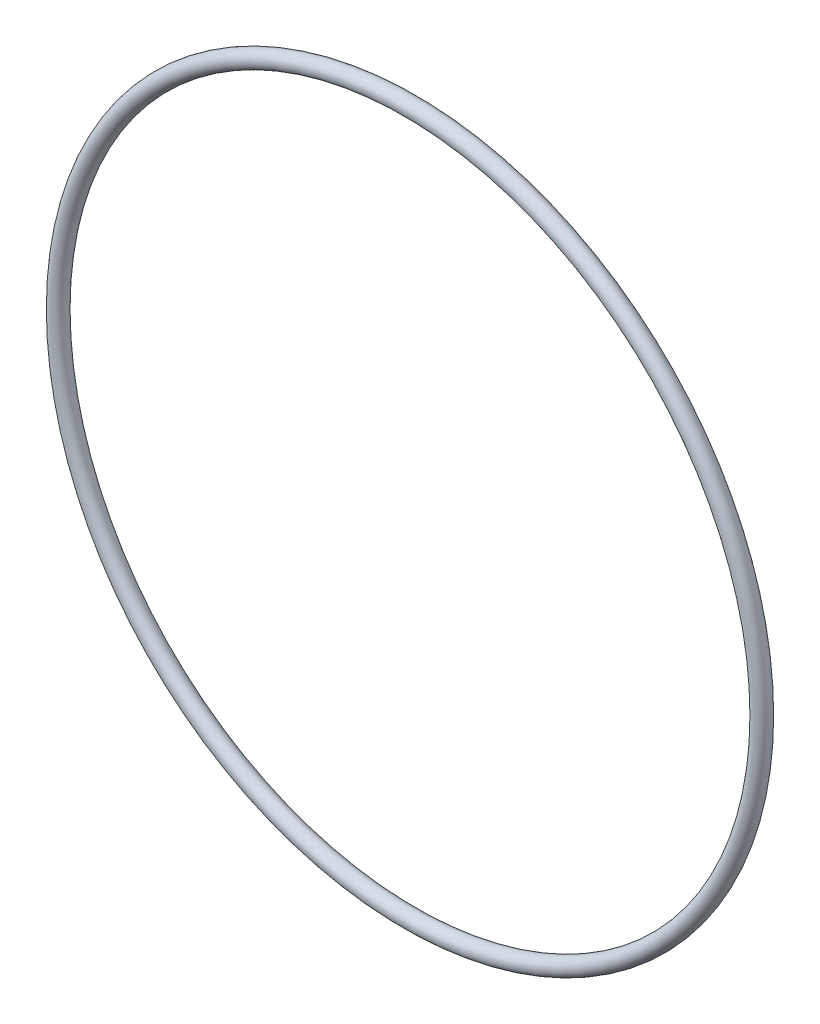
ISO-10303-21;
HEADER;
FILE_DESCRIPTION(('STEP AP214'),'2;1');
FILE_NAME('part.step','',(''),(''),'','','');
FILE_SCHEMA(('AUTOMOTIVE_DESIGN { 1 0 10303 214 1 1 1 1 }'));
ENDSEC;
DATA;
#1=APPLICATION_CONTEXT('core data for automotive mechanical design processes');
#2=APPLICATION_PROTOCOL_DEFINITION('international standard','automotive_design',2000,#1);
#3=PRODUCT_CONTEXT('',#1,'mechanical');
#4=PRODUCT('Part','Part','',(#3));
#5=PRODUCT_RELATED_PRODUCT_CATEGORY('part','',(#4));
#6=PRODUCT_DEFINITION_FORMATION('','',#4);
#7=PRODUCT_DEFINITION_CONTEXT('part definition',#1,'design');
#8=PRODUCT_DEFINITION('design','',#6,#7);
#9=PRODUCT_DEFINITION_SHAPE('','',#8);
#10=(LENGTH_UNIT() NAMED_UNIT(*) SI_UNIT(.MILLI.,.METRE.));
#11=(NAMED_UNIT(*) PLANE_ANGLE_UNIT() SI_UNIT($,.RADIAN.));
#12=(NAMED_UNIT(*) SI_UNIT($,.STERADIAN.) SOLID_ANGLE_UNIT());
#13=UNCERTAINTY_MEASURE_WITH_UNIT(LENGTH_MEASURE(1.E-05),#10,'distance_accuracy_value','');
#14=(GEOMETRIC_REPRESENTATION_CONTEXT(3) GLOBAL_UNCERTAINTY_ASSIGNED_CONTEXT((#13)) GLOBAL_UNIT_ASSIGNED_CONTEXT((#10,
#11,#12)) REPRESENTATION_CONTEXT('',''));
#15=CARTESIAN_POINT('',(0.,0.,0.));
#16=DIRECTION('',(0.,0.,1.));
#17=DIRECTION('',(1.,0.,0.));
#18=AXIS2_PLACEMENT_3D('',#15,#16,#17);
#19=CARTESIAN_POINT('',(0.,0.,0.));
#20=DIRECTION('',(0.,0.,1.));
#21=DIRECTION('',(1.,0.,0.));
#22=AXIS2_PLACEMENT_3D('',#19,#20,#21);
#23=TOROIDAL_SURFACE('',#22,37.2618,0.889000000000003);
#24=CARTESIAN_POINT('',(38.1508,0.,0.));
#25=VERTEX_POINT('',#24);
#26=VERTEX_LOOP('',#25);
#27=FACE_BOUND('',#26,.T.);
#28=ADVANCED_FACE('F27',(#27),#23,.T.);
#29=CLOSED_SHELL('',(#28));
#30=MANIFOLD_SOLID_BREP('B2',#29);
#31=ADVANCED_BREP_SHAPE_REPRESENTATION('',(#18,#30),#14);
#32=SHAPE_DEFINITION_REPRESENTATION(#9,#31);
ENDSEC;
END-ISO-10303-21;
